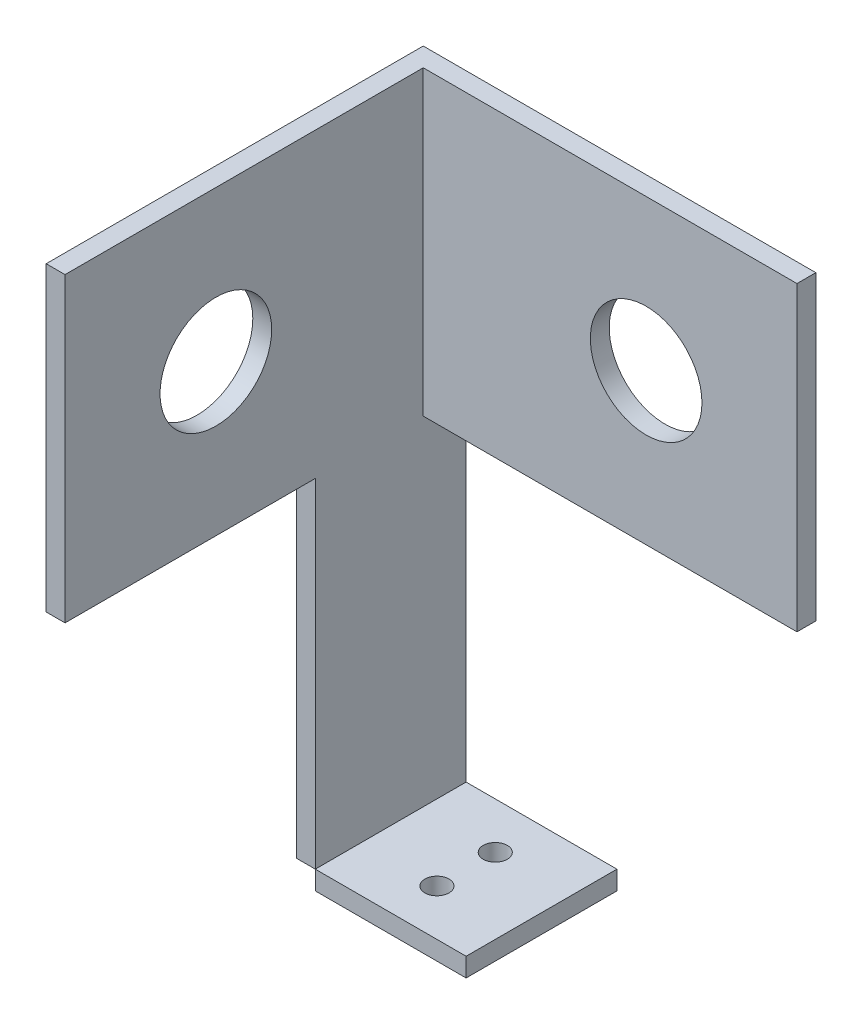
ISO-10303-21;
HEADER;
FILE_DESCRIPTION(('STEP AP214'),'2;1');
FILE_NAME('part.step','',(''),(''),'','','');
FILE_SCHEMA(('AUTOMOTIVE_DESIGN { 1 0 10303 214 1 1 1 1 }'));
ENDSEC;
DATA;
#1=APPLICATION_CONTEXT('core data for automotive mechanical design processes');
#2=APPLICATION_PROTOCOL_DEFINITION('international standard','automotive_design',2000,#1);
#3=PRODUCT_CONTEXT('',#1,'mechanical');
#4=PRODUCT('Part','Part','',(#3));
#5=PRODUCT_RELATED_PRODUCT_CATEGORY('part','',(#4));
#6=PRODUCT_DEFINITION_FORMATION('','',#4);
#7=PRODUCT_DEFINITION_CONTEXT('part definition',#1,'design');
#8=PRODUCT_DEFINITION('design','',#6,#7);
#9=PRODUCT_DEFINITION_SHAPE('','',#8);
#10=(LENGTH_UNIT() NAMED_UNIT(*) SI_UNIT(.MILLI.,.METRE.));
#11=(NAMED_UNIT(*) PLANE_ANGLE_UNIT() SI_UNIT($,.RADIAN.));
#12=(NAMED_UNIT(*) SI_UNIT($,.STERADIAN.) SOLID_ANGLE_UNIT());
#13=UNCERTAINTY_MEASURE_WITH_UNIT(LENGTH_MEASURE(1.E-05),#10,'distance_accuracy_value','');
#14=(GEOMETRIC_REPRESENTATION_CONTEXT(3) GLOBAL_UNCERTAINTY_ASSIGNED_CONTEXT((#13)) GLOBAL_UNIT_ASSIGNED_CONTEXT((#10,
#11,#12)) REPRESENTATION_CONTEXT('',''));
#15=CARTESIAN_POINT('',(0.,0.,0.));
#16=DIRECTION('',(0.,0.,1.));
#17=DIRECTION('',(1.,0.,0.));
#18=AXIS2_PLACEMENT_3D('',#15,#16,#17);
#19=CARTESIAN_POINT('',(15.875,-82.3825951024,-308.841609519));
#20=DIRECTION('',(0.,-1.,0.));
#21=DIRECTION('',(0.,0.,-1.));
#22=AXIS2_PLACEMENT_3D('',#19,#20,#21);
#23=PLANE('',#22);
#24=CARTESIAN_POINT('',(15.875,-82.3825951024,-313.752276185666));
#25=DIRECTION('',(0.,-1.,0.));
#26=DIRECTION('',(0.,0.,-1.));
#27=AXIS2_PLACEMENT_3D('',#24,#25,#26);
#28=CIRCLE('',#27,2.032);
#29=CARTESIAN_POINT('',(15.875,-82.3825951024,-315.784276185666));
#30=VERTEX_POINT('',#29);
#31=EDGE_CURVE('P0_E82',#30,#30,#28,.T.);
#32=ORIENTED_EDGE('',*,*,#31,.T.);
#33=EDGE_LOOP('',(#32));
#34=FACE_BOUND('',#33,.T.);
#35=CARTESIAN_POINT('',(15.875,-82.3825951024,-303.930942852334));
#36=DIRECTION('',(0.,-1.,0.));
#37=DIRECTION('',(0.,0.,-1.));
#38=AXIS2_PLACEMENT_3D('',#35,#36,#37);
#39=CIRCLE('',#38,2.032);
#40=CARTESIAN_POINT('',(15.875,-82.3825951024,-305.962942852334));
#41=VERTEX_POINT('',#40);
#42=EDGE_CURVE('P0_E18',#41,#41,#39,.T.);
#43=ORIENTED_EDGE('',*,*,#42,.T.);
#44=EDGE_LOOP('',(#43));
#45=FACE_BOUND('',#44,.T.);
#46=DIRECTION('',(0.,0.,-1.));
#47=VECTOR('',#46,1.);
#48=CARTESIAN_POINT('',(3.175,-82.3825951024,-296.141609519));
#49=LINE('',#48,#47);
#50=CARTESIAN_POINT('',(3.175,-82.3825951024,-321.541609519));
#51=VERTEX_POINT('',#50);
#52=CARTESIAN_POINT('',(3.175,-82.3825951024,-296.141609519));
#53=VERTEX_POINT('',#52);
#54=EDGE_CURVE('P0_E91',#51,#53,#49,.F.);
#55=ORIENTED_EDGE('',*,*,#54,.T.);
#56=DIRECTION('',(-1.,0.,0.));
#57=VECTOR('',#56,1.);
#58=CARTESIAN_POINT('',(28.575,-82.3825951024,-296.141609519));
#59=LINE('',#58,#57);
#60=CARTESIAN_POINT('',(28.575,-82.3825951024,-296.141609519));
#61=VERTEX_POINT('',#60);
#62=EDGE_CURVE('P0_E53',#53,#61,#59,.F.);
#63=ORIENTED_EDGE('',*,*,#62,.T.);
#64=DIRECTION('',(0.,0.,1.));
#65=VECTOR('',#64,1.);
#66=CARTESIAN_POINT('',(28.575,-82.3825951024,-321.541609519));
#67=LINE('',#66,#65);
#68=CARTESIAN_POINT('',(28.575,-82.3825951024,-321.541609519));
#69=VERTEX_POINT('',#68);
#70=EDGE_CURVE('P0_E55',#61,#69,#67,.F.);
#71=ORIENTED_EDGE('',*,*,#70,.T.);
#72=DIRECTION('',(1.,0.,0.));
#73=VECTOR('',#72,1.);
#74=CARTESIAN_POINT('',(3.175,-82.3825951024,-321.541609519));
#75=LINE('',#74,#73);
#76=EDGE_CURVE('P0_E57',#69,#51,#75,.F.);
#77=ORIENTED_EDGE('',*,*,#76,.T.);
#78=EDGE_LOOP('',(#55,#63,#71,#77));
#79=FACE_BOUND('',#78,.T.);
#80=ADVANCED_FACE('P0_F15',(#34,#45,#79),#23,.F.);
#81=CARTESIAN_POINT('',(3.175,-85.5575951024,-321.541609519));
#82=DIRECTION('',(0.,0.,1.));
#83=DIRECTION('',(1.,0.,0.));
#84=AXIS2_PLACEMENT_3D('',#81,#82,#83);
#85=PLANE('',#84);
#86=DIRECTION('',(0.,1.,0.));
#87=VECTOR('',#86,1.);
#88=CARTESIAN_POINT('',(3.175,-85.5575951024,-321.541609519));
#89=LINE('',#88,#87);
#90=CARTESIAN_POINT('',(3.175,-85.5575951024,-321.541609519));
#91=VERTEX_POINT('',#90);
#92=EDGE_CURVE('P0_E68',#91,#51,#89,.T.);
#93=ORIENTED_EDGE('',*,*,#92,.T.);
#94=ORIENTED_EDGE('',*,*,#76,.F.);
#95=DIRECTION('',(0.,1.,0.));
#96=VECTOR('',#95,1.);
#97=CARTESIAN_POINT('',(28.575,-85.5575951024,-321.541609519));
#98=LINE('',#97,#96);
#99=CARTESIAN_POINT('',(28.575,-85.5575951024,-321.541609519));
#100=VERTEX_POINT('',#99);
#101=EDGE_CURVE('P0_E62',#69,#100,#98,.F.);
#102=ORIENTED_EDGE('',*,*,#101,.T.);
#103=DIRECTION('',(1.,0.,0.));
#104=VECTOR('',#103,1.);
#105=CARTESIAN_POINT('',(15.875,-85.5575951024,-321.541609519));
#106=LINE('',#105,#104);
#107=EDGE_CURVE('P0_E84',#91,#100,#106,.T.);
#108=ORIENTED_EDGE('',*,*,#107,.F.);
#109=EDGE_LOOP('',(#93,#94,#102,#108));
#110=FACE_BOUND('',#109,.T.);
#111=ADVANCED_FACE('P0_F65',(#110),#85,.F.);
#112=CARTESIAN_POINT('',(28.575,-85.5575951024,-321.541609519));
#113=DIRECTION('',(-1.,0.,0.));
#114=DIRECTION('',(0.,0.,1.));
#115=AXIS2_PLACEMENT_3D('',#112,#113,#114);
#116=PLANE('',#115);
#117=ORIENTED_EDGE('',*,*,#101,.F.);
#118=ORIENTED_EDGE('',*,*,#70,.F.);
#119=DIRECTION('',(0.,1.,0.));
#120=VECTOR('',#119,1.);
#121=CARTESIAN_POINT('',(28.575,-85.5575951024,-296.141609519));
#122=LINE('',#121,#120);
#123=CARTESIAN_POINT('',(28.575,-85.5575951024,-296.141609519));
#124=VERTEX_POINT('',#123);
#125=EDGE_CURVE('P0_E76',#61,#124,#122,.F.);
#126=ORIENTED_EDGE('',*,*,#125,.T.);
#127=DIRECTION('',(0.,0.,-1.));
#128=VECTOR('',#127,1.);
#129=CARTESIAN_POINT('',(28.575,-85.5575951024,-308.841609519));
#130=LINE('',#129,#128);
#131=EDGE_CURVE('P0_E73',#100,#124,#130,.F.);
#132=ORIENTED_EDGE('',*,*,#131,.F.);
#133=EDGE_LOOP('',(#117,#118,#126,#132));
#134=FACE_BOUND('',#133,.T.);
#135=ADVANCED_FACE('P0_F71',(#134),#116,.F.);
#136=CARTESIAN_POINT('',(28.575,-85.5575951024,-296.141609519));
#137=DIRECTION('',(0.,0.,-1.));
#138=DIRECTION('',(-1.,0.,0.));
#139=AXIS2_PLACEMENT_3D('',#136,#137,#138);
#140=PLANE('',#139);
#141=ORIENTED_EDGE('',*,*,#125,.F.);
#142=ORIENTED_EDGE('',*,*,#62,.F.);
#143=DIRECTION('',(0.,1.,0.));
#144=VECTOR('',#143,1.);
#145=CARTESIAN_POINT('',(3.175,-85.5575951024,-296.141609519));
#146=LINE('',#145,#144);
#147=CARTESIAN_POINT('',(3.175,-85.5575951024,-296.141609519));
#148=VERTEX_POINT('',#147);
#149=EDGE_CURVE('P0_E33',#53,#148,#146,.F.);
#150=ORIENTED_EDGE('',*,*,#149,.T.);
#151=DIRECTION('',(1.,0.,0.));
#152=VECTOR('',#151,1.);
#153=CARTESIAN_POINT('',(15.875,-85.5575951024,-296.141609519));
#154=LINE('',#153,#152);
#155=EDGE_CURVE('P0_E97',#124,#148,#154,.F.);
#156=ORIENTED_EDGE('',*,*,#155,.F.);
#157=EDGE_LOOP('',(#141,#142,#150,#156));
#158=FACE_BOUND('',#157,.T.);
#159=ADVANCED_FACE('P0_F98',(#158),#140,.F.);
#160=CARTESIAN_POINT('',(3.175,-85.5575951024,-296.141609519));
#161=DIRECTION('',(1.,0.,0.));
#162=DIRECTION('',(0.,0.,-1.));
#163=AXIS2_PLACEMENT_3D('',#160,#161,#162);
#164=PLANE('',#163);
#165=ORIENTED_EDGE('',*,*,#149,.F.);
#166=ORIENTED_EDGE('',*,*,#54,.F.);
#167=ORIENTED_EDGE('',*,*,#92,.F.);
#168=DIRECTION('',(0.,0.,-1.));
#169=VECTOR('',#168,1.);
#170=CARTESIAN_POINT('',(3.175,-85.5575951024,-308.841609519));
#171=LINE('',#170,#169);
#172=EDGE_CURVE('P0_E81',#148,#91,#171,.T.);
#173=ORIENTED_EDGE('',*,*,#172,.F.);
#174=EDGE_LOOP('',(#165,#166,#167,#173));
#175=FACE_BOUND('',#174,.T.);
#176=ADVANCED_FACE('P0_F105',(#175),#164,.F.);
#177=CARTESIAN_POINT('',(15.875,-85.5575951024,-303.930942852334));
#178=DIRECTION('',(0.,-1.,0.));
#179=DIRECTION('',(0.,0.,-1.));
#180=AXIS2_PLACEMENT_3D('',#177,#178,#179);
#181=CYLINDRICAL_SURFACE('',#180,2.032);
#182=CARTESIAN_POINT('',(15.875,-85.5575951024,-303.930942852334));
#183=DIRECTION('',(0.,-1.,0.));
#184=DIRECTION('',(0.,0.,-1.));
#185=AXIS2_PLACEMENT_3D('',#182,#183,#184);
#186=CIRCLE('',#185,2.032);
#187=CARTESIAN_POINT('',(15.875,-85.5575951024,-305.962942852334));
#188=VERTEX_POINT('',#187);
#189=EDGE_CURVE('P0_E24',#188,#188,#186,.F.);
#190=ORIENTED_EDGE('',*,*,#189,.F.);
#191=EDGE_LOOP('',(#190));
#192=FACE_BOUND('',#191,.T.);
#193=ORIENTED_EDGE('',*,*,#42,.F.);
#194=EDGE_LOOP('',(#193));
#195=FACE_BOUND('',#194,.T.);
#196=ADVANCED_FACE('P0_F107',(#192,#195),#181,.F.);
#197=CARTESIAN_POINT('',(15.875,-85.5575951024,-313.752276185666));
#198=DIRECTION('',(0.,-1.,0.));
#199=DIRECTION('',(0.,0.,-1.));
#200=AXIS2_PLACEMENT_3D('',#197,#198,#199);
#201=CYLINDRICAL_SURFACE('',#200,2.032);
#202=CARTESIAN_POINT('',(15.875,-85.5575951024,-313.752276185666));
#203=DIRECTION('',(0.,-1.,0.));
#204=DIRECTION('',(0.,0.,-1.));
#205=AXIS2_PLACEMENT_3D('',#202,#203,#204);
#206=CIRCLE('',#205,2.032);
#207=CARTESIAN_POINT('',(15.875,-85.5575951024,-315.784276185666));
#208=VERTEX_POINT('',#207);
#209=EDGE_CURVE('P0_E10',#208,#208,#206,.F.);
#210=ORIENTED_EDGE('',*,*,#209,.F.);
#211=EDGE_LOOP('',(#210));
#212=FACE_BOUND('',#211,.T.);
#213=ORIENTED_EDGE('',*,*,#31,.F.);
#214=EDGE_LOOP('',(#213));
#215=FACE_BOUND('',#214,.T.);
#216=ADVANCED_FACE('P0_F114',(#212,#215),#201,.F.);
#217=CARTESIAN_POINT('',(15.875,-85.5575951024,-308.841609519));
#218=DIRECTION('',(0.,-1.,0.));
#219=DIRECTION('',(0.,0.,-1.));
#220=AXIS2_PLACEMENT_3D('',#217,#218,#219);
#221=PLANE('',#220);
#222=ORIENTED_EDGE('',*,*,#209,.T.);
#223=EDGE_LOOP('',(#222));
#224=FACE_BOUND('',#223,.T.);
#225=ORIENTED_EDGE('',*,*,#189,.T.);
#226=EDGE_LOOP('',(#225));
#227=FACE_BOUND('',#226,.T.);
#228=ORIENTED_EDGE('',*,*,#155,.T.);
#229=ORIENTED_EDGE('',*,*,#172,.T.);
#230=ORIENTED_EDGE('',*,*,#107,.T.);
#231=ORIENTED_EDGE('',*,*,#131,.T.);
#232=EDGE_LOOP('',(#228,#229,#230,#231));
#233=FACE_BOUND('',#232,.T.);
#234=ADVANCED_FACE('P0_F102',(#224,#227,#233),#221,.T.);
#235=CLOSED_SHELL('',(#80,#111,#135,#159,#176,#196,#216,#234));
#236=MANIFOLD_SOLID_BREP('P0_B1',#235);
#237=CARTESIAN_POINT('',(0.,-25.4,25.4));
#238=DIRECTION('',(0.,-1.,0.));
#239=DIRECTION('',(0.,0.,-1.));
#240=AXIS2_PLACEMENT_3D('',#237,#238,#239);
#241=PLANE('',#240);
#242=DIRECTION('',(0.,0.,1.));
#243=VECTOR('',#242,1.);
#244=CARTESIAN_POINT('',(66.1113494382,-25.4,-317.5));
#245=LINE('',#244,#243);
#246=CARTESIAN_POINT('',(66.1113494382,-25.4,-314.325));
#247=VERTEX_POINT('',#246);
#248=CARTESIAN_POINT('',(66.1113494382,-25.4,-317.5));
#249=VERTEX_POINT('',#248);
#250=EDGE_CURVE('P1_E112',#247,#249,#245,.F.);
#251=ORIENTED_EDGE('',*,*,#250,.F.);
#252=DIRECTION('',(1.,0.,0.));
#253=VECTOR('',#252,1.);
#254=CARTESIAN_POINT('',(33.0556747191,-25.4,-314.325));
#255=LINE('',#254,#253);
#256=CARTESIAN_POINT('',(3.175,-25.3999999999999,-314.325));
#257=VERTEX_POINT('',#256);
#258=EDGE_CURVE('P1_E99',#257,#247,#255,.T.);
#259=ORIENTED_EDGE('',*,*,#258,.F.);
#260=DIRECTION('',(0.,0.,-1.));
#261=VECTOR('',#260,1.);
#262=CARTESIAN_POINT('',(3.175,-25.4,-146.05));
#263=LINE('',#262,#261);
#264=CARTESIAN_POINT('',(3.175,-25.4,-317.5));
#265=VERTEX_POINT('',#264);
#266=EDGE_CURVE('P1_E93',#265,#257,#263,.F.);
#267=ORIENTED_EDGE('',*,*,#266,.F.);
#268=DIRECTION('',(-1.,0.,0.));
#269=VECTOR('',#268,1.);
#270=CARTESIAN_POINT('',(0.,-25.4,-317.5));
#271=LINE('',#270,#269);
#272=EDGE_CURVE('P1_E118',#249,#265,#271,.T.);
#273=ORIENTED_EDGE('',*,*,#272,.F.);
#274=EDGE_LOOP('',(#251,#259,#267,#273));
#275=FACE_BOUND('',#274,.T.);
#276=ADVANCED_FACE('P1_F16',(#275),#241,.T.);
#277=CARTESIAN_POINT('',(40.7113494382,0.,-317.5));
#278=DIRECTION('',(0.,0.,1.));
#279=DIRECTION('',(1.,0.,0.));
#280=AXIS2_PLACEMENT_3D('',#277,#278,#279);
#281=CYLINDRICAL_SURFACE('',#280,9.398);
#282=CARTESIAN_POINT('',(40.7113494382,0.,-317.5));
#283=DIRECTION('',(0.,0.,1.));
#284=DIRECTION('',(1.,0.,0.));
#285=AXIS2_PLACEMENT_3D('',#282,#283,#284);
#286=CIRCLE('',#285,9.398);
#287=CARTESIAN_POINT('',(50.1093494382,0.,-317.5));
#288=VERTEX_POINT('',#287);
#289=EDGE_CURVE('P1_E127',#288,#288,#286,.T.);
#290=ORIENTED_EDGE('',*,*,#289,.F.);
#291=EDGE_LOOP('',(#290));
#292=FACE_BOUND('',#291,.T.);
#293=CARTESIAN_POINT('',(40.7113494382,0.,-314.325));
#294=DIRECTION('',(0.,0.,1.));
#295=DIRECTION('',(1.,0.,0.));
#296=AXIS2_PLACEMENT_3D('',#293,#294,#295);
#297=CIRCLE('',#296,9.398);
#298=CARTESIAN_POINT('',(50.1093494382,0.,-314.325));
#299=VERTEX_POINT('',#298);
#300=EDGE_CURVE('P1_E19',#299,#299,#297,.F.);
#301=ORIENTED_EDGE('',*,*,#300,.F.);
#302=EDGE_LOOP('',(#301));
#303=FACE_BOUND('',#302,.T.);
#304=ADVANCED_FACE('P1_F342',(#292,#303),#281,.F.);
#305=CARTESIAN_POINT('',(33.0556747191,0.,-314.325));
#306=DIRECTION('',(0.,0.,1.));
#307=DIRECTION('',(1.,0.,0.));
#308=AXIS2_PLACEMENT_3D('',#305,#306,#307);
#309=PLANE('',#308);
#310=ORIENTED_EDGE('',*,*,#300,.T.);
#311=EDGE_LOOP('',(#310));
#312=FACE_BOUND('',#311,.T.);
#313=DIRECTION('',(0.,1.,0.));
#314=VECTOR('',#313,1.);
#315=CARTESIAN_POINT('',(66.1113494382,-25.4,-314.325));
#316=LINE('',#315,#314);
#317=CARTESIAN_POINT('',(66.1113494382,25.4,-314.325));
#318=VERTEX_POINT('',#317);
#319=EDGE_CURVE('P1_E103',#318,#247,#316,.F.);
#320=ORIENTED_EDGE('',*,*,#319,.F.);
#321=DIRECTION('',(1.,0.,0.));
#322=VECTOR('',#321,1.);
#323=CARTESIAN_POINT('',(0.,25.4000000000003,-314.325));
#324=LINE('',#323,#322);
#325=CARTESIAN_POINT('',(3.175,25.4000000000001,-314.325));
#326=VERTEX_POINT('',#325);
#327=EDGE_CURVE('P1_E134',#326,#318,#324,.T.);
#328=ORIENTED_EDGE('',*,*,#327,.F.);
#329=DIRECTION('',(0.,1.,0.));
#330=VECTOR('',#329,1.);
#331=CARTESIAN_POINT('',(3.175,0.,-314.325));
#332=LINE('',#331,#330);
#333=EDGE_CURVE('P1_E105',#257,#326,#332,.T.);
#334=ORIENTED_EDGE('',*,*,#333,.F.);
#335=ORIENTED_EDGE('',*,*,#258,.T.);
#336=EDGE_LOOP('',(#320,#328,#334,#335));
#337=FACE_BOUND('',#336,.T.);
#338=ADVANCED_FACE('P1_F101',(#312,#337),#309,.T.);
#339=CARTESIAN_POINT('',(66.1113494382,-25.4,-317.5));
#340=DIRECTION('',(1.,0.,0.));
#341=DIRECTION('',(0.,1.,0.));
#342=AXIS2_PLACEMENT_3D('',#339,#340,#341);
#343=PLANE('',#342);
#344=ORIENTED_EDGE('',*,*,#319,.T.);
#345=ORIENTED_EDGE('',*,*,#250,.T.);
#346=DIRECTION('',(0.,1.,0.));
#347=VECTOR('',#346,1.);
#348=CARTESIAN_POINT('',(66.1113494382,-25.3999999999999,-317.5));
#349=LINE('',#348,#347);
#350=CARTESIAN_POINT('',(66.1113494382,25.4000000000001,-317.5));
#351=VERTEX_POINT('',#350);
#352=EDGE_CURVE('P1_E141',#351,#249,#349,.F.);
#353=ORIENTED_EDGE('',*,*,#352,.F.);
#354=DIRECTION('',(0.,0.,1.));
#355=VECTOR('',#354,1.);
#356=CARTESIAN_POINT('',(66.1113494382,25.4000000000003,-317.5));
#357=LINE('',#356,#355);
#358=EDGE_CURVE('P1_E114',#318,#351,#357,.F.);
#359=ORIENTED_EDGE('',*,*,#358,.F.);
#360=EDGE_LOOP('',(#344,#345,#353,#359));
#361=FACE_BOUND('',#360,.T.);
#362=ADVANCED_FACE('P1_F110',(#361),#343,.T.);
#363=CARTESIAN_POINT('',(3.175,0.,-146.05));
#364=DIRECTION('',(1.,0.,0.));
#365=DIRECTION('',(0.,0.,-1.));
#366=AXIS2_PLACEMENT_3D('',#363,#364,#365);
#367=PLANE('',#366);
#368=CARTESIAN_POINT('',(3.175,0.,-279.4));
#369=DIRECTION('',(1.,0.,0.));
#370=DIRECTION('',(0.,0.,-1.));
#371=AXIS2_PLACEMENT_3D('',#368,#369,#370);
#372=CIRCLE('',#371,9.398);
#373=CARTESIAN_POINT('',(3.175,0.,-288.798));
#374=VERTEX_POINT('',#373);
#375=EDGE_CURVE('P1_E123',#374,#374,#372,.F.);
#376=ORIENTED_EDGE('',*,*,#375,.T.);
#377=EDGE_LOOP('',(#376));
#378=FACE_BOUND('',#377,.T.);
#379=ORIENTED_EDGE('',*,*,#333,.T.);
#380=DIRECTION('',(0.,0.,1.));
#381=VECTOR('',#380,1.);
#382=CARTESIAN_POINT('',(3.175,25.4000000000003,-317.5));
#383=LINE('',#382,#381);
#384=CARTESIAN_POINT('',(3.175,25.4000000000001,-254.));
#385=VERTEX_POINT('',#384);
#386=EDGE_CURVE('P1_E129',#385,#326,#383,.F.);
#387=ORIENTED_EDGE('',*,*,#386,.F.);
#388=DIRECTION('',(0.,1.,0.));
#389=VECTOR('',#388,1.);
#390=CARTESIAN_POINT('',(3.175,-188.856572809209,-254.));
#391=LINE('',#390,#389);
#392=CARTESIAN_POINT('',(3.175,-25.3999999999999,-254.));
#393=VERTEX_POINT('',#392);
#394=EDGE_CURVE('P1_E173',#385,#393,#391,.F.);
#395=ORIENTED_EDGE('',*,*,#394,.T.);
#396=DIRECTION('',(0.,0.,-1.));
#397=VECTOR('',#396,1.);
#398=CARTESIAN_POINT('',(3.175,-25.4,25.4));
#399=LINE('',#398,#397);
#400=CARTESIAN_POINT('',(3.175,-25.3999999999999,-296.141609519));
#401=VERTEX_POINT('',#400);
#402=EDGE_CURVE('P1_E162',#401,#393,#399,.F.);
#403=ORIENTED_EDGE('',*,*,#402,.F.);
#404=DIRECTION('',(0.,1.,0.));
#405=VECTOR('',#404,1.);
#406=CARTESIAN_POINT('',(3.175,-82.3825951024,-296.141609519));
#407=LINE('',#406,#405);
#408=CARTESIAN_POINT('',(3.175,-82.3825951024,-296.141609519));
#409=VERTEX_POINT('',#408);
#410=EDGE_CURVE('P1_E160',#409,#401,#407,.T.);
#411=ORIENTED_EDGE('',*,*,#410,.F.);
#412=DIRECTION('',(0.,0.,-1.));
#413=VECTOR('',#412,1.);
#414=CARTESIAN_POINT('',(3.175,-82.3825951024,-321.541609519));
#415=LINE('',#414,#413);
#416=CARTESIAN_POINT('',(3.175,-82.3825951024,-321.541609519));
#417=VERTEX_POINT('',#416);
#418=EDGE_CURVE('P1_E156',#417,#409,#415,.F.);
#419=ORIENTED_EDGE('',*,*,#418,.F.);
#420=DIRECTION('',(0.,1.,0.));
#421=VECTOR('',#420,1.);
#422=CARTESIAN_POINT('',(3.175,-25.4,-321.541609519));
#423=LINE('',#422,#421);
#424=CARTESIAN_POINT('',(3.175,-25.4,-321.541609519));
#425=VERTEX_POINT('',#424);
#426=EDGE_CURVE('P1_E152',#425,#417,#423,.F.);
#427=ORIENTED_EDGE('',*,*,#426,.F.);
#428=DIRECTION('',(0.,0.,1.));
#429=VECTOR('',#428,1.);
#430=CARTESIAN_POINT('',(3.175,-25.4,-296.141609519));
#431=LINE('',#430,#429);
#432=EDGE_CURVE('P1_E148',#265,#425,#431,.F.);
#433=ORIENTED_EDGE('',*,*,#432,.F.);
#434=ORIENTED_EDGE('',*,*,#266,.T.);
#435=EDGE_LOOP('',(#379,#387,#395,#403,#411,#419,#427,#433,#434));
#436=FACE_BOUND('',#435,.T.);
#437=ADVANCED_FACE('P1_F163',(#378,#436),#367,.T.);
#438=CARTESIAN_POINT('',(0.,-25.4,25.4));
#439=DIRECTION('',(0.,-1.,0.));
#440=DIRECTION('',(0.,0.,-1.));
#441=AXIS2_PLACEMENT_3D('',#438,#439,#440);
#442=PLANE('',#441);
#443=DIRECTION('',(1.,0.,0.));
#444=VECTOR('',#443,1.);
#445=CARTESIAN_POINT('',(3.175,-25.4,-296.141609519));
#446=LINE('',#445,#444);
#447=CARTESIAN_POINT('',(0.,-25.3999999999999,-296.141609519));
#448=VERTEX_POINT('',#447);
#449=EDGE_CURVE('P1_E158',#401,#448,#446,.F.);
#450=ORIENTED_EDGE('',*,*,#449,.F.);
#451=ORIENTED_EDGE('',*,*,#402,.T.);
#452=DIRECTION('',(1.,0.,0.));
#453=VECTOR('',#452,1.);
#454=CARTESIAN_POINT('',(3.175,-25.3999999999999,-254.));
#455=LINE('',#454,#453);
#456=CARTESIAN_POINT('',(0.,-25.3999999999999,-254.));
#457=VERTEX_POINT('',#456);
#458=EDGE_CURVE('P1_E126',#393,#457,#455,.F.);
#459=ORIENTED_EDGE('',*,*,#458,.T.);
#460=DIRECTION('',(0.,0.,-1.));
#461=VECTOR('',#460,1.);
#462=CARTESIAN_POINT('',(0.,-25.3999999999999,-146.05));
#463=LINE('',#462,#461);
#464=EDGE_CURVE('P1_E125',#457,#448,#463,.T.);
#465=ORIENTED_EDGE('',*,*,#464,.T.);
#466=EDGE_LOOP('',(#450,#451,#459,#465));
#467=FACE_BOUND('',#466,.T.);
#468=ADVANCED_FACE('P1_F223',(#467),#442,.T.);
#469=CARTESIAN_POINT('',(3.175,-82.3825951024,-296.141609519));
#470=DIRECTION('',(0.,0.,1.));
#471=DIRECTION('',(1.,0.,0.));
#472=AXIS2_PLACEMENT_3D('',#469,#470,#471);
#473=PLANE('',#472);
#474=DIRECTION('',(0.,1.,0.));
#475=VECTOR('',#474,1.);
#476=CARTESIAN_POINT('',(0.,0.,-296.141609519));
#477=LINE('',#476,#475);
#478=CARTESIAN_POINT('',(0.,-82.3825951024,-296.141609519));
#479=VERTEX_POINT('',#478);
#480=EDGE_CURVE('P1_E179',#448,#479,#477,.F.);
#481=ORIENTED_EDGE('',*,*,#480,.T.);
#482=DIRECTION('',(1.,0.,0.));
#483=VECTOR('',#482,1.);
#484=CARTESIAN_POINT('',(3.175,-82.3825951024,-296.141609519));
#485=LINE('',#484,#483);
#486=EDGE_CURVE('P1_E154',#409,#479,#485,.F.);
#487=ORIENTED_EDGE('',*,*,#486,.F.);
#488=ORIENTED_EDGE('',*,*,#410,.T.);
#489=ORIENTED_EDGE('',*,*,#449,.T.);
#490=EDGE_LOOP('',(#481,#487,#488,#489));
#491=FACE_BOUND('',#490,.T.);
#492=ADVANCED_FACE('P1_F219',(#491),#473,.T.);
#493=CARTESIAN_POINT('',(3.175,-82.3825951024,-321.541609519));
#494=DIRECTION('',(0.,-1.,0.));
#495=DIRECTION('',(0.,0.,-1.));
#496=AXIS2_PLACEMENT_3D('',#493,#494,#495);
#497=PLANE('',#496);
#498=DIRECTION('',(0.,0.,-1.));
#499=VECTOR('',#498,1.);
#500=CARTESIAN_POINT('',(0.,-82.3825951024,-146.05));
#501=LINE('',#500,#499);
#502=CARTESIAN_POINT('',(0.,-82.3825951024,-321.541609519));
#503=VERTEX_POINT('',#502);
#504=EDGE_CURVE('P1_E182',#479,#503,#501,.T.);
#505=ORIENTED_EDGE('',*,*,#504,.T.);
#506=DIRECTION('',(-1.,0.,0.));
#507=VECTOR('',#506,1.);
#508=CARTESIAN_POINT('',(3.175,-82.3825951024,-321.541609519));
#509=LINE('',#508,#507);
#510=EDGE_CURVE('P1_E150',#417,#503,#509,.T.);
#511=ORIENTED_EDGE('',*,*,#510,.F.);
#512=ORIENTED_EDGE('',*,*,#418,.T.);
#513=ORIENTED_EDGE('',*,*,#486,.T.);
#514=EDGE_LOOP('',(#505,#511,#512,#513));
#515=FACE_BOUND('',#514,.T.);
#516=ADVANCED_FACE('P1_F215',(#515),#497,.T.);
#517=CARTESIAN_POINT('',(3.175,-25.4,-321.541609519));
#518=DIRECTION('',(0.,0.,-1.));
#519=DIRECTION('',(-1.,0.,0.));
#520=AXIS2_PLACEMENT_3D('',#517,#518,#519);
#521=PLANE('',#520);
#522=DIRECTION('',(0.,1.,0.));
#523=VECTOR('',#522,1.);
#524=CARTESIAN_POINT('',(0.,0.,-321.541609519));
#525=LINE('',#524,#523);
#526=CARTESIAN_POINT('',(0.,-25.4,-321.541609519));
#527=VERTEX_POINT('',#526);
#528=EDGE_CURVE('P1_E185',#503,#527,#525,.T.);
#529=ORIENTED_EDGE('',*,*,#528,.T.);
#530=DIRECTION('',(1.,0.,0.));
#531=VECTOR('',#530,1.);
#532=CARTESIAN_POINT('',(3.175,-25.4,-321.541609519));
#533=LINE('',#532,#531);
#534=EDGE_CURVE('P1_E146',#425,#527,#533,.F.);
#535=ORIENTED_EDGE('',*,*,#534,.F.);
#536=ORIENTED_EDGE('',*,*,#426,.T.);
#537=ORIENTED_EDGE('',*,*,#510,.T.);
#538=EDGE_LOOP('',(#529,#535,#536,#537));
#539=FACE_BOUND('',#538,.T.);
#540=ADVANCED_FACE('P1_F210',(#539),#521,.T.);
#541=CARTESIAN_POINT('',(3.175,-25.4,-296.141609519));
#542=DIRECTION('',(0.,1.,0.));
#543=DIRECTION('',(0.,0.,1.));
#544=AXIS2_PLACEMENT_3D('',#541,#542,#543);
#545=PLANE('',#544);
#546=ORIENTED_EDGE('',*,*,#534,.T.);
#547=DIRECTION('',(0.,0.,-1.));
#548=VECTOR('',#547,1.);
#549=CARTESIAN_POINT('',(0.,-25.4,-146.05));
#550=LINE('',#549,#548);
#551=CARTESIAN_POINT('',(0.,-25.4,-317.5));
#552=VERTEX_POINT('',#551);
#553=EDGE_CURVE('P1_E188',#527,#552,#550,.F.);
#554=ORIENTED_EDGE('',*,*,#553,.T.);
#555=DIRECTION('',(-1.,0.,0.));
#556=VECTOR('',#555,1.);
#557=CARTESIAN_POINT('',(0.,-25.4,-317.5));
#558=LINE('',#557,#556);
#559=EDGE_CURVE('P1_E130',#265,#552,#558,.T.);
#560=ORIENTED_EDGE('',*,*,#559,.F.);
#561=ORIENTED_EDGE('',*,*,#432,.T.);
#562=EDGE_LOOP('',(#546,#554,#560,#561));
#563=FACE_BOUND('',#562,.T.);
#564=ADVANCED_FACE('P1_F206',(#563),#545,.T.);
#565=CARTESIAN_POINT('',(0.,-25.3999999999999,-317.5));
#566=DIRECTION('',(0.,0.,-1.));
#567=DIRECTION('',(-1.,0.,0.));
#568=AXIS2_PLACEMENT_3D('',#565,#566,#567);
#569=PLANE('',#568);
#570=ORIENTED_EDGE('',*,*,#289,.T.);
#571=EDGE_LOOP('',(#570));
#572=FACE_BOUND('',#571,.T.);
#573=ORIENTED_EDGE('',*,*,#272,.T.);
#574=ORIENTED_EDGE('',*,*,#559,.T.);
#575=DIRECTION('',(0.,1.,0.));
#576=VECTOR('',#575,1.);
#577=CARTESIAN_POINT('',(0.,0.,-317.5));
#578=LINE('',#577,#576);
#579=CARTESIAN_POINT('',(0.,25.4000000000003,-317.5));
#580=VERTEX_POINT('',#579);
#581=EDGE_CURVE('P1_E191',#552,#580,#578,.T.);
#582=ORIENTED_EDGE('',*,*,#581,.T.);
#583=DIRECTION('',(1.,0.,0.));
#584=VECTOR('',#583,1.);
#585=CARTESIAN_POINT('',(0.,25.4000000000003,-317.5));
#586=LINE('',#585,#584);
#587=EDGE_CURVE('P1_E168',#351,#580,#586,.F.);
#588=ORIENTED_EDGE('',*,*,#587,.F.);
#589=ORIENTED_EDGE('',*,*,#352,.T.);
#590=EDGE_LOOP('',(#573,#574,#582,#588,#589));
#591=FACE_BOUND('',#590,.T.);
#592=ADVANCED_FACE('P1_F202',(#572,#591),#569,.T.);
#593=CARTESIAN_POINT('',(0.,25.4000000000003,-317.5));
#594=DIRECTION('',(0.,1.,0.));
#595=DIRECTION('',(0.,0.,1.));
#596=AXIS2_PLACEMENT_3D('',#593,#594,#595);
#597=PLANE('',#596);
#598=ORIENTED_EDGE('',*,*,#587,.T.);
#599=DIRECTION('',(0.,0.,-1.));
#600=VECTOR('',#599,1.);
#601=CARTESIAN_POINT('',(0.,25.4000000000003,-146.05));
#602=LINE('',#601,#600);
#603=CARTESIAN_POINT('',(0.,25.4000000000002,-254.));
#604=VERTEX_POINT('',#603);
#605=EDGE_CURVE('P1_E193',#580,#604,#602,.F.);
#606=ORIENTED_EDGE('',*,*,#605,.T.);
#607=DIRECTION('',(1.,0.,0.));
#608=VECTOR('',#607,1.);
#609=CARTESIAN_POINT('',(3.175,25.4,-254.));
#610=LINE('',#609,#608);
#611=EDGE_CURVE('P1_E34',#604,#385,#610,.T.);
#612=ORIENTED_EDGE('',*,*,#611,.T.);
#613=ORIENTED_EDGE('',*,*,#386,.T.);
#614=ORIENTED_EDGE('',*,*,#327,.T.);
#615=ORIENTED_EDGE('',*,*,#358,.T.);
#616=EDGE_LOOP('',(#598,#606,#612,#613,#614,#615));
#617=FACE_BOUND('',#616,.T.);
#618=ADVANCED_FACE('P1_F166',(#617),#597,.T.);
#619=CARTESIAN_POINT('',(3.175,-188.856572809209,-254.));
#620=DIRECTION('',(0.,0.,-1.));
#621=DIRECTION('',(0.,1.,0.));
#622=AXIS2_PLACEMENT_3D('',#619,#620,#621);
#623=PLANE('',#622);
#624=ORIENTED_EDGE('',*,*,#394,.F.);
#625=ORIENTED_EDGE('',*,*,#611,.F.);
#626=DIRECTION('',(0.,1.,0.));
#627=VECTOR('',#626,1.);
#628=CARTESIAN_POINT('',(0.,0.,-254.));
#629=LINE('',#628,#627);
#630=EDGE_CURVE('P1_E25',#604,#457,#629,.F.);
#631=ORIENTED_EDGE('',*,*,#630,.T.);
#632=ORIENTED_EDGE('',*,*,#458,.F.);
#633=EDGE_LOOP('',(#624,#625,#631,#632));
#634=FACE_BOUND('',#633,.T.);
#635=ADVANCED_FACE('P1_F196',(#634),#623,.F.);
#636=CARTESIAN_POINT('',(0.,0.,-279.4));
#637=DIRECTION('',(1.,0.,0.));
#638=DIRECTION('',(0.,0.,-1.));
#639=AXIS2_PLACEMENT_3D('',#636,#637,#638);
#640=CYLINDRICAL_SURFACE('',#639,9.398);
#641=CARTESIAN_POINT('',(0.,0.,-279.4));
#642=DIRECTION('',(1.,0.,0.));
#643=DIRECTION('',(0.,0.,-1.));
#644=AXIS2_PLACEMENT_3D('',#641,#642,#643);
#645=CIRCLE('',#644,9.398);
#646=CARTESIAN_POINT('',(0.,0.,-288.798));
#647=VERTEX_POINT('',#646);
#648=EDGE_CURVE('P1_E11',#647,#647,#645,.F.);
#649=ORIENTED_EDGE('',*,*,#648,.T.);
#650=EDGE_LOOP('',(#649));
#651=FACE_BOUND('',#650,.T.);
#652=ORIENTED_EDGE('',*,*,#375,.F.);
#653=EDGE_LOOP('',(#652));
#654=FACE_BOUND('',#653,.T.);
#655=ADVANCED_FACE('P1_F235',(#651,#654),#640,.F.);
#656=CARTESIAN_POINT('',(0.,0.,-146.05));
#657=DIRECTION('',(1.,0.,0.));
#658=DIRECTION('',(0.,0.,-1.));
#659=AXIS2_PLACEMENT_3D('',#656,#657,#658);
#660=PLANE('',#659);
#661=ORIENTED_EDGE('',*,*,#648,.F.);
#662=EDGE_LOOP('',(#661));
#663=FACE_BOUND('',#662,.T.);
#664=ORIENTED_EDGE('',*,*,#605,.F.);
#665=ORIENTED_EDGE('',*,*,#581,.F.);
#666=ORIENTED_EDGE('',*,*,#553,.F.);
#667=ORIENTED_EDGE('',*,*,#528,.F.);
#668=ORIENTED_EDGE('',*,*,#504,.F.);
#669=ORIENTED_EDGE('',*,*,#480,.F.);
#670=ORIENTED_EDGE('',*,*,#464,.F.);
#671=ORIENTED_EDGE('',*,*,#630,.F.);
#672=EDGE_LOOP('',(#664,#665,#666,#667,#668,#669,#670,#671));
#673=FACE_BOUND('',#672,.T.);
#674=ADVANCED_FACE('P1_F199',(#663,#673),#660,.F.);
#675=CLOSED_SHELL('',(#276,#304,#338,#362,#437,#468,#492,#516,#540,#564,#592,#618,#635,#655,#674));
#676=MANIFOLD_SOLID_BREP('P1_B1',#675);
#677=ADVANCED_BREP_SHAPE_REPRESENTATION('',(#18,#236,#676),#14);
#678=SHAPE_DEFINITION_REPRESENTATION(#9,#677);
ENDSEC;
END-ISO-10303-21;
